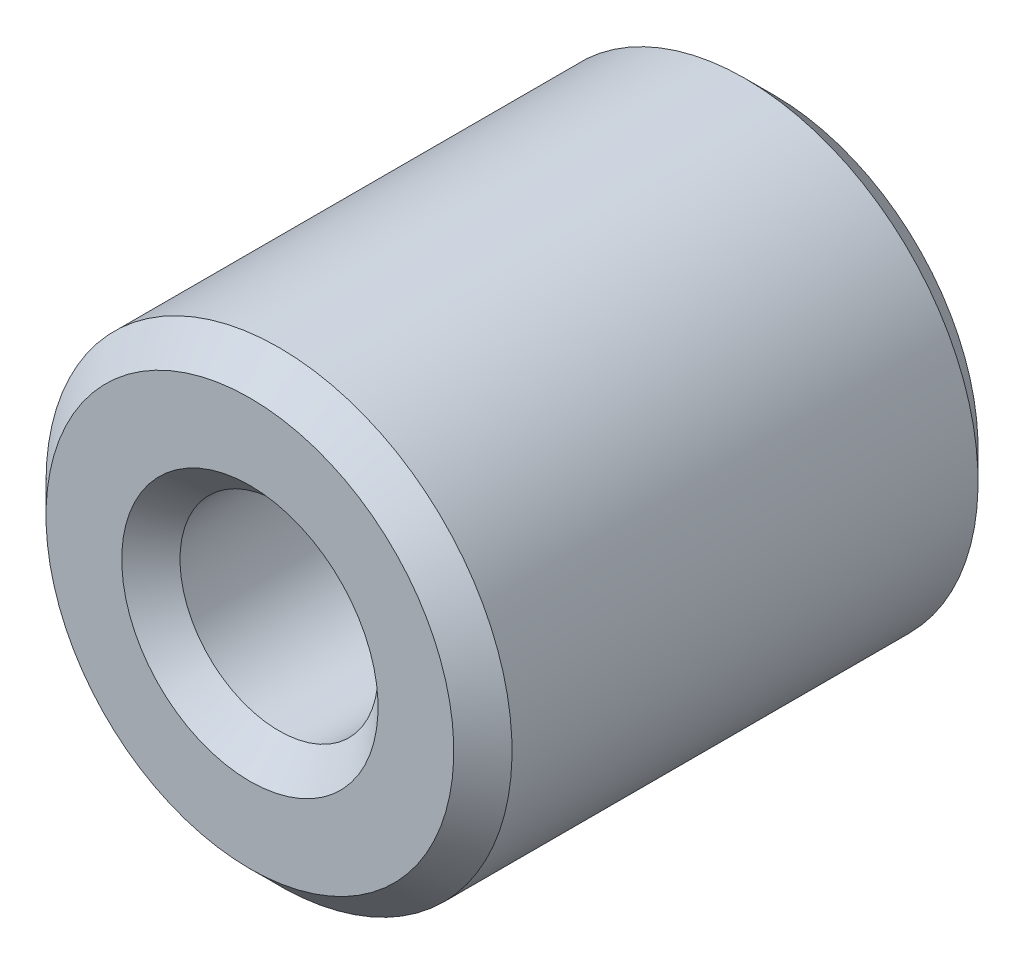
ISO-10303-21;
HEADER;
FILE_DESCRIPTION(('STEP AP214'),'2;1');
FILE_NAME('part.step','',(''),(''),'','','');
FILE_SCHEMA(('AUTOMOTIVE_DESIGN { 1 0 10303 214 1 1 1 1 }'));
ENDSEC;
DATA;
#1=APPLICATION_CONTEXT('core data for automotive mechanical design processes');
#2=APPLICATION_PROTOCOL_DEFINITION('international standard','automotive_design',2000,#1);
#3=PRODUCT_CONTEXT('',#1,'mechanical');
#4=PRODUCT('Part','Part','',(#3));
#5=PRODUCT_RELATED_PRODUCT_CATEGORY('part','',(#4));
#6=PRODUCT_DEFINITION_FORMATION('','',#4);
#7=PRODUCT_DEFINITION_CONTEXT('part definition',#1,'design');
#8=PRODUCT_DEFINITION('design','',#6,#7);
#9=PRODUCT_DEFINITION_SHAPE('','',#8);
#10=(LENGTH_UNIT() NAMED_UNIT(*) SI_UNIT(.MILLI.,.METRE.));
#11=(NAMED_UNIT(*) PLANE_ANGLE_UNIT() SI_UNIT($,.RADIAN.));
#12=(NAMED_UNIT(*) SI_UNIT($,.STERADIAN.) SOLID_ANGLE_UNIT());
#13=UNCERTAINTY_MEASURE_WITH_UNIT(LENGTH_MEASURE(1.E-05),#10,'distance_accuracy_value','');
#14=(GEOMETRIC_REPRESENTATION_CONTEXT(3) GLOBAL_UNCERTAINTY_ASSIGNED_CONTEXT((#13)) GLOBAL_UNIT_ASSIGNED_CONTEXT((#10,
#11,#12)) REPRESENTATION_CONTEXT('',''));
#15=CARTESIAN_POINT('',(0.,0.,0.));
#16=DIRECTION('',(0.,0.,1.));
#17=DIRECTION('',(1.,0.,0.));
#18=AXIS2_PLACEMENT_3D('',#15,#16,#17);
#19=CARTESIAN_POINT('',(0.,0.,0.4999999999847));
#20=DIRECTION('',(0.,0.,1.));
#21=DIRECTION('',(0.,-1.,0.));
#22=AXIS2_PLACEMENT_3D('',#19,#20,#21);
#23=CONICAL_SURFACE('',#22,7.499999999985,0.785398163397448);
#24=CARTESIAN_POINT('',(0.,0.,1.));
#25=DIRECTION('',(0.,0.,-1.));
#26=DIRECTION('',(1.,0.,0.));
#27=AXIS2_PLACEMENT_3D('',#24,#25,#26);
#28=CIRCLE('',#27,8.);
#29=CARTESIAN_POINT('',(-8.,0.,1.));
#30=VERTEX_POINT('',#29);
#31=CARTESIAN_POINT('',(0.,8.00000000000015,0.99999999999985));
#32=VERTEX_POINT('',#31);
#33=EDGE_CURVE('E21',#30,#32,#28,.T.);
#34=ORIENTED_EDGE('',*,*,#33,.T.);
#35=DIRECTION('',(0.,-0.707106781186548,-0.707106781186548));
#36=VECTOR('',#35,1.);
#37=CARTESIAN_POINT('',(0.,7.499999999985,0.4999999999847));
#38=LINE('',#37,#36);
#39=CARTESIAN_POINT('',(0.,7.00000000000015,-1.50504608775748E-13));
#40=VERTEX_POINT('',#39);
#41=EDGE_CURVE('E11',#32,#40,#38,.T.);
#42=ORIENTED_EDGE('',*,*,#41,.T.);
#43=CARTESIAN_POINT('',(0.,0.,0.));
#44=DIRECTION('',(0.,0.,-1.));
#45=DIRECTION('',(-1.,0.,0.));
#46=AXIS2_PLACEMENT_3D('',#43,#44,#45);
#47=CIRCLE('',#46,7.);
#48=EDGE_CURVE('E112',#40,#40,#47,.T.);
#49=ORIENTED_EDGE('',*,*,#48,.F.);
#50=ORIENTED_EDGE('',*,*,#41,.F.);
#51=CARTESIAN_POINT('',(0.,0.,1.));
#52=DIRECTION('',(0.,0.,-1.));
#53=DIRECTION('',(1.,0.,0.));
#54=AXIS2_PLACEMENT_3D('',#51,#52,#53);
#55=CIRCLE('',#54,8.);
#56=EDGE_CURVE('E125',#32,#30,#55,.T.);
#57=ORIENTED_EDGE('',*,*,#56,.T.);
#58=EDGE_LOOP('',(#34,#42,#49,#50,#57));
#59=FACE_BOUND('',#58,.T.);
#60=ADVANCED_FACE('F17',(#59),#23,.T.);
#61=CARTESIAN_POINT('',(0.,0.,0.));
#62=DIRECTION('',(0.,0.,1.));
#63=DIRECTION('',(1.,0.,0.));
#64=AXIS2_PLACEMENT_3D('',#61,#62,#63);
#65=CYLINDRICAL_SURFACE('',#64,8.);
#66=CARTESIAN_POINT('',(0.,0.,17.));
#67=DIRECTION('',(0.,0.,1.));
#68=DIRECTION('',(1.,0.,0.));
#69=AXIS2_PLACEMENT_3D('',#66,#67,#68);
#70=CIRCLE('',#69,8.);
#71=CARTESIAN_POINT('',(-8.,0.,17.));
#72=VERTEX_POINT('',#71);
#73=CARTESIAN_POINT('',(0.,8.0000000000025,17.0000000000025));
#74=VERTEX_POINT('',#73);
#75=EDGE_CURVE('E131',#72,#74,#70,.T.);
#76=ORIENTED_EDGE('',*,*,#75,.F.);
#77=DIRECTION('',(0.,0.,-1.));
#78=VECTOR('',#77,1.);
#79=CARTESIAN_POINT('',(-8.,0.,0.));
#80=LINE('',#79,#78);
#81=EDGE_CURVE('E116',#72,#30,#80,.T.);
#82=ORIENTED_EDGE('',*,*,#81,.T.);
#83=ORIENTED_EDGE('',*,*,#56,.F.);
#84=ORIENTED_EDGE('',*,*,#33,.F.);
#85=ORIENTED_EDGE('',*,*,#81,.F.);
#86=CARTESIAN_POINT('',(0.,0.,17.));
#87=DIRECTION('',(0.,0.,1.));
#88=DIRECTION('',(1.,0.,0.));
#89=AXIS2_PLACEMENT_3D('',#86,#87,#88);
#90=CIRCLE('',#89,8.);
#91=EDGE_CURVE('E113',#74,#72,#90,.T.);
#92=ORIENTED_EDGE('',*,*,#91,.F.);
#93=EDGE_LOOP('',(#76,#82,#83,#84,#85,#92));
#94=FACE_BOUND('',#93,.T.);
#95=ADVANCED_FACE('F161',(#94),#65,.T.);
#96=CARTESIAN_POINT('',(0.,0.,17.50000000002));
#97=DIRECTION('',(0.,0.,-1.));
#98=DIRECTION('',(0.,-1.,0.));
#99=AXIS2_PLACEMENT_3D('',#96,#97,#98);
#100=CONICAL_SURFACE('',#99,7.499999999985,0.785398163397448);
#101=ORIENTED_EDGE('',*,*,#75,.T.);
#102=DIRECTION('',(0.,-0.707106781186548,0.707106781186548));
#103=VECTOR('',#102,1.);
#104=CARTESIAN_POINT('',(0.,7.499999999985,17.50000000002));
#105=LINE('',#104,#103);
#106=CARTESIAN_POINT('',(0.,7.0000000000025,18.0000000000025));
#107=VERTEX_POINT('',#106);
#108=EDGE_CURVE('E117',#74,#107,#105,.T.);
#109=ORIENTED_EDGE('',*,*,#108,.T.);
#110=CARTESIAN_POINT('',(0.,0.,18.));
#111=DIRECTION('',(0.,0.,1.));
#112=DIRECTION('',(1.,0.,0.));
#113=AXIS2_PLACEMENT_3D('',#110,#111,#112);
#114=CIRCLE('',#113,7.);
#115=EDGE_CURVE('E132',#107,#107,#114,.T.);
#116=ORIENTED_EDGE('',*,*,#115,.F.);
#117=ORIENTED_EDGE('',*,*,#108,.F.);
#118=ORIENTED_EDGE('',*,*,#91,.T.);
#119=EDGE_LOOP('',(#101,#109,#116,#117,#118));
#120=FACE_BOUND('',#119,.T.);
#121=ADVANCED_FACE('F154',(#120),#100,.T.);
#122=CARTESIAN_POINT('',(0.,0.,18.));
#123=DIRECTION('',(0.,0.,1.));
#124=DIRECTION('',(1.,0.,0.));
#125=AXIS2_PLACEMENT_3D('',#122,#123,#124);
#126=PLANE('',#125);
#127=CARTESIAN_POINT('',(0.,0.,18.));
#128=DIRECTION('',(0.,0.,-1.));
#129=DIRECTION('',(1.,0.,0.));
#130=AXIS2_PLACEMENT_3D('',#127,#128,#129);
#131=CIRCLE('',#130,4.4);
#132=CARTESIAN_POINT('',(0.,4.3999999999985,18.0000000000015));
#133=VERTEX_POINT('',#132);
#134=EDGE_CURVE('E88',#133,#133,#131,.T.);
#135=ORIENTED_EDGE('',*,*,#134,.T.);
#136=EDGE_LOOP('',(#135));
#137=FACE_BOUND('',#136,.T.);
#138=ORIENTED_EDGE('',*,*,#115,.T.);
#139=EDGE_LOOP('',(#138));
#140=FACE_BOUND('',#139,.T.);
#141=ADVANCED_FACE('F151',(#137,#140),#126,.T.);
#142=CARTESIAN_POINT('',(0.,0.,17.49999999969));
#143=DIRECTION('',(0.,0.,1.));
#144=DIRECTION('',(0.,-1.,0.));
#145=AXIS2_PLACEMENT_3D('',#142,#143,#144);
#146=CONICAL_SURFACE('',#145,3.899999999687,0.785398163397448);
#147=CARTESIAN_POINT('',(0.,0.,17.));
#148=DIRECTION('',(0.,0.,-1.));
#149=DIRECTION('',(1.,0.,0.));
#150=AXIS2_PLACEMENT_3D('',#147,#148,#149);
#151=CIRCLE('',#150,3.4);
#152=CARTESIAN_POINT('',(3.4,0.,17.));
#153=VERTEX_POINT('',#152);
#154=CARTESIAN_POINT('',(0.,3.3999999999985,17.0000000000015));
#155=VERTEX_POINT('',#154);
#156=EDGE_CURVE('E90',#153,#155,#151,.T.);
#157=ORIENTED_EDGE('',*,*,#156,.T.);
#158=DIRECTION('',(0.,0.707106781186548,0.707106781186548));
#159=VECTOR('',#158,1.);
#160=CARTESIAN_POINT('',(0.,3.899999999687,17.49999999969));
#161=LINE('',#160,#159);
#162=EDGE_CURVE('E83',#155,#133,#161,.T.);
#163=ORIENTED_EDGE('',*,*,#162,.T.);
#164=ORIENTED_EDGE('',*,*,#134,.F.);
#165=ORIENTED_EDGE('',*,*,#162,.F.);
#166=CARTESIAN_POINT('',(0.,0.,17.));
#167=DIRECTION('',(0.,0.,-1.));
#168=DIRECTION('',(1.,0.,0.));
#169=AXIS2_PLACEMENT_3D('',#166,#167,#168);
#170=CIRCLE('',#169,3.4);
#171=EDGE_CURVE('E86',#155,#153,#170,.T.);
#172=ORIENTED_EDGE('',*,*,#171,.T.);
#173=EDGE_LOOP('',(#157,#163,#164,#165,#172));
#174=FACE_BOUND('',#173,.T.);
#175=ADVANCED_FACE('F19',(#174),#146,.F.);
#176=CARTESIAN_POINT('',(0.,0.,-2.845));
#177=DIRECTION('',(0.,0.,1.));
#178=DIRECTION('',(-1.,0.,0.));
#179=AXIS2_PLACEMENT_3D('',#176,#177,#178);
#180=CYLINDRICAL_SURFACE('',#179,3.4);
#181=CARTESIAN_POINT('',(0.,0.,1.));
#182=DIRECTION('',(0.,0.,1.));
#183=DIRECTION('',(1.,0.,0.));
#184=AXIS2_PLACEMENT_3D('',#181,#182,#183);
#185=CIRCLE('',#184,3.4);
#186=CARTESIAN_POINT('',(0.,3.4000000000001,1.0000000000001));
#187=VERTEX_POINT('',#186);
#188=CARTESIAN_POINT('',(3.4,0.,1.));
#189=VERTEX_POINT('',#188);
#190=EDGE_CURVE('E111',#187,#189,#185,.T.);
#191=ORIENTED_EDGE('',*,*,#190,.F.);
#192=CARTESIAN_POINT('',(0.,0.,1.));
#193=DIRECTION('',(0.,0.,1.));
#194=DIRECTION('',(1.,0.,0.));
#195=AXIS2_PLACEMENT_3D('',#192,#193,#194);
#196=CIRCLE('',#195,3.4);
#197=EDGE_CURVE('E122',#189,#187,#196,.T.);
#198=ORIENTED_EDGE('',*,*,#197,.F.);
#199=DIRECTION('',(0.,0.,1.));
#200=VECTOR('',#199,1.);
#201=CARTESIAN_POINT('',(3.4,0.,-2.845));
#202=LINE('',#201,#200);
#203=EDGE_CURVE('E98',#189,#153,#202,.T.);
#204=ORIENTED_EDGE('',*,*,#203,.T.);
#205=ORIENTED_EDGE('',*,*,#171,.F.);
#206=ORIENTED_EDGE('',*,*,#156,.F.);
#207=ORIENTED_EDGE('',*,*,#203,.F.);
#208=EDGE_LOOP('',(#191,#198,#204,#205,#206,#207));
#209=FACE_BOUND('',#208,.T.);
#210=ADVANCED_FACE('F96',(#209),#180,.F.);
#211=CARTESIAN_POINT('',(0.,0.,0.5000000003132));
#212=DIRECTION('',(0.,0.,-1.));
#213=DIRECTION('',(0.,-1.,0.));
#214=AXIS2_PLACEMENT_3D('',#211,#212,#213);
#215=CONICAL_SURFACE('',#214,3.899999999687,0.785398163397448);
#216=ORIENTED_EDGE('',*,*,#190,.T.);
#217=ORIENTED_EDGE('',*,*,#197,.T.);
#218=DIRECTION('',(0.,0.707106781186548,-0.707106781186548));
#219=VECTOR('',#218,1.);
#220=CARTESIAN_POINT('',(0.,3.899999999687,0.5000000003132));
#221=LINE('',#220,#219);
#222=CARTESIAN_POINT('',(0.,4.4000000000001,0.));
#223=VERTEX_POINT('',#222);
#224=EDGE_CURVE('E104',#187,#223,#221,.T.);
#225=ORIENTED_EDGE('',*,*,#224,.T.);
#226=CARTESIAN_POINT('',(0.,0.,0.));
#227=DIRECTION('',(0.,0.,1.));
#228=DIRECTION('',(1.,0.,0.));
#229=AXIS2_PLACEMENT_3D('',#226,#227,#228);
#230=CIRCLE('',#229,4.4);
#231=EDGE_CURVE('E107',#223,#223,#230,.T.);
#232=ORIENTED_EDGE('',*,*,#231,.F.);
#233=ORIENTED_EDGE('',*,*,#224,.F.);
#234=EDGE_LOOP('',(#216,#217,#225,#232,#233));
#235=FACE_BOUND('',#234,.T.);
#236=ADVANCED_FACE('F177',(#235),#215,.F.);
#237=CARTESIAN_POINT('',(0.,0.,0.));
#238=DIRECTION('',(0.,0.,1.));
#239=DIRECTION('',(1.,0.,0.));
#240=AXIS2_PLACEMENT_3D('',#237,#238,#239);
#241=PLANE('',#240);
#242=ORIENTED_EDGE('',*,*,#231,.T.);
#243=EDGE_LOOP('',(#242));
#244=FACE_BOUND('',#243,.T.);
#245=ORIENTED_EDGE('',*,*,#48,.T.);
#246=EDGE_LOOP('',(#245));
#247=FACE_BOUND('',#246,.T.);
#248=ADVANCED_FACE('F181',(#244,#247),#241,.F.);
#249=CLOSED_SHELL('',(#60,#95,#121,#141,#175,#210,#236,#248));
#250=MANIFOLD_SOLID_BREP('B1',#249);
#251=ADVANCED_BREP_SHAPE_REPRESENTATION('',(#18,#250),#14);
#252=SHAPE_DEFINITION_REPRESENTATION(#9,#251);
ENDSEC;
END-ISO-10303-21;
